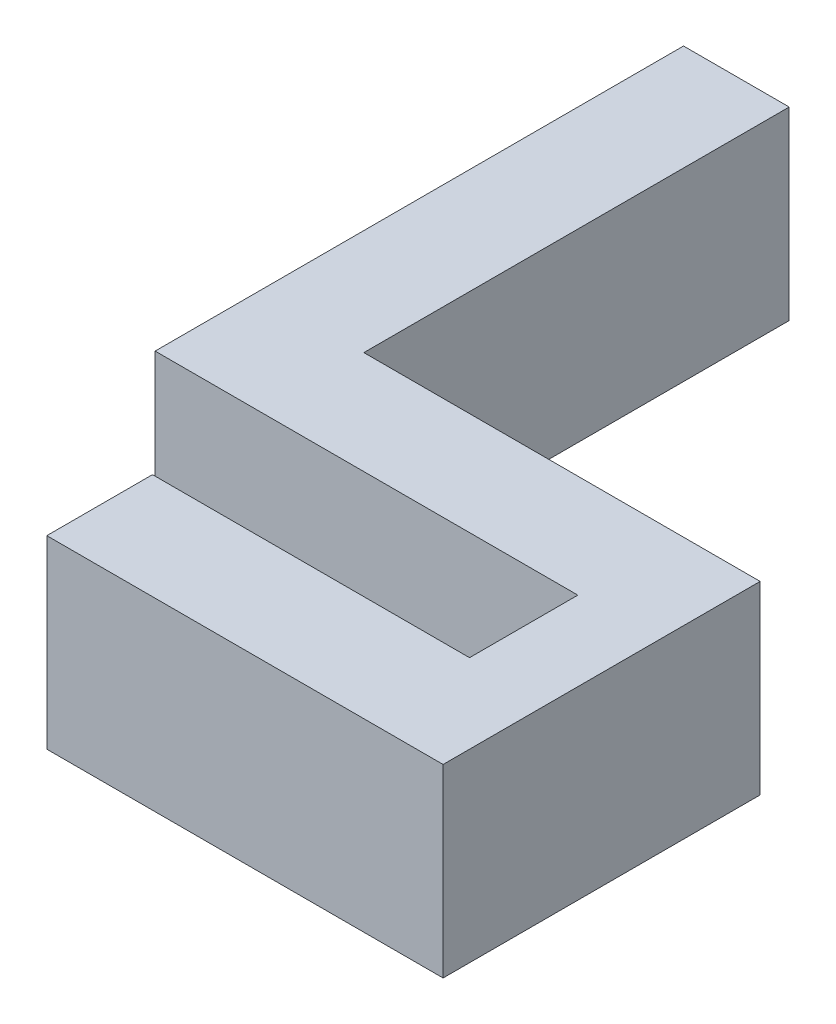
ISO-10303-21;
HEADER;
FILE_DESCRIPTION(('STEP AP214'),'2;1');
FILE_NAME('part.step','',(''),(''),'','','');
FILE_SCHEMA(('AUTOMOTIVE_DESIGN { 1 0 10303 214 1 1 1 1 }'));
ENDSEC;
DATA;
#1=APPLICATION_CONTEXT('core data for automotive mechanical design processes');
#2=APPLICATION_PROTOCOL_DEFINITION('international standard','automotive_design',2000,#1);
#3=PRODUCT_CONTEXT('',#1,'mechanical');
#4=PRODUCT('Part','Part','',(#3));
#5=PRODUCT_RELATED_PRODUCT_CATEGORY('part','',(#4));
#6=PRODUCT_DEFINITION_FORMATION('','',#4);
#7=PRODUCT_DEFINITION_CONTEXT('part definition',#1,'design');
#8=PRODUCT_DEFINITION('design','',#6,#7);
#9=PRODUCT_DEFINITION_SHAPE('','',#8);
#10=(LENGTH_UNIT() NAMED_UNIT(*) SI_UNIT(.MILLI.,.METRE.));
#11=(NAMED_UNIT(*) PLANE_ANGLE_UNIT() SI_UNIT($,.RADIAN.));
#12=(NAMED_UNIT(*) SI_UNIT($,.STERADIAN.) SOLID_ANGLE_UNIT());
#13=UNCERTAINTY_MEASURE_WITH_UNIT(LENGTH_MEASURE(1.E-05),#10,'distance_accuracy_value','');
#14=(GEOMETRIC_REPRESENTATION_CONTEXT(3) GLOBAL_UNCERTAINTY_ASSIGNED_CONTEXT((#13)) GLOBAL_UNIT_ASSIGNED_CONTEXT((#10,
#11,#12)) REPRESENTATION_CONTEXT('',''));
#15=CARTESIAN_POINT('',(0.,0.,0.));
#16=DIRECTION('',(0.,0.,1.));
#17=DIRECTION('',(1.,0.,0.));
#18=AXIS2_PLACEMENT_3D('',#15,#16,#17);
#19=CARTESIAN_POINT('',(0.,0.,0.));
#20=DIRECTION('',(0.,-1.,0.));
#21=DIRECTION('',(0.,0.,-1.));
#22=AXIS2_PLACEMENT_3D('',#19,#20,#21);
#23=PLANE('',#22);
#24=DIRECTION('',(0.,0.,1.));
#25=VECTOR('',#24,1.);
#26=CARTESIAN_POINT('',(12.,0.,0.));
#27=LINE('',#26,#25);
#28=CARTESIAN_POINT('',(12.,0.,-3.9));
#29=VERTEX_POINT('',#28);
#30=CARTESIAN_POINT('',(12.,0.,4.1));
#31=VERTEX_POINT('',#30);
#32=EDGE_CURVE('E160',#29,#31,#27,.T.);
#33=ORIENTED_EDGE('',*,*,#32,.F.);
#34=DIRECTION('',(-1.,0.,0.));
#35=VECTOR('',#34,1.);
#36=CARTESIAN_POINT('',(1.59259259259261,0.,-3.9));
#37=LINE('',#36,#35);
#38=CARTESIAN_POINT('',(15.,0.,-3.9));
#39=VERTEX_POINT('',#38);
#40=EDGE_CURVE('E177',#39,#29,#37,.T.);
#41=ORIENTED_EDGE('',*,*,#40,.F.);
#42=DIRECTION('',(0.,0.,-1.));
#43=VECTOR('',#42,1.);
#44=CARTESIAN_POINT('',(15.,0.,8.1));
#45=LINE('',#44,#43);
#46=CARTESIAN_POINT('',(15.,0.,8.1));
#47=VERTEX_POINT('',#46);
#48=EDGE_CURVE('E173',#47,#39,#45,.T.);
#49=ORIENTED_EDGE('',*,*,#48,.F.);
#50=DIRECTION('',(1.,0.,0.));
#51=VECTOR('',#50,1.);
#52=CARTESIAN_POINT('',(0.,0.,8.1));
#53=LINE('',#52,#51);
#54=CARTESIAN_POINT('',(0.,0.,8.1));
#55=VERTEX_POINT('',#54);
#56=EDGE_CURVE('E170',#55,#47,#53,.T.);
#57=ORIENTED_EDGE('',*,*,#56,.F.);
#58=DIRECTION('',(0.,0.,1.));
#59=VECTOR('',#58,1.);
#60=CARTESIAN_POINT('',(0.,0.,4.1));
#61=LINE('',#60,#59);
#62=CARTESIAN_POINT('',(0.,0.,4.1));
#63=VERTEX_POINT('',#62);
#64=EDGE_CURVE('E167',#63,#55,#61,.T.);
#65=ORIENTED_EDGE('',*,*,#64,.F.);
#66=DIRECTION('',(-1.,0.,0.));
#67=VECTOR('',#66,1.);
#68=CARTESIAN_POINT('',(12.,0.,4.1));
#69=LINE('',#68,#67);
#70=EDGE_CURVE('E164',#31,#63,#69,.T.);
#71=ORIENTED_EDGE('',*,*,#70,.F.);
#72=EDGE_LOOP('',(#33,#41,#49,#57,#65,#71));
#73=FACE_BOUND('',#72,.T.);
#74=ADVANCED_FACE('F45',(#73),#23,.T.);
#75=CARTESIAN_POINT('',(0.,7.,0.));
#76=DIRECTION('',(0.,0.,-1.));
#77=DIRECTION('',(-1.,0.,0.));
#78=AXIS2_PLACEMENT_3D('',#75,#76,#77);
#79=PLANE('',#78);
#80=DIRECTION('',(1.,0.,0.));
#81=VECTOR('',#80,1.);
#82=CARTESIAN_POINT('',(0.,0.,0.));
#83=LINE('',#82,#81);
#84=CARTESIAN_POINT('',(-4.,0.,0.));
#85=VERTEX_POINT('',#84);
#86=CARTESIAN_POINT('',(0.,0.,0.));
#87=VERTEX_POINT('',#86);
#88=EDGE_CURVE('E100',#85,#87,#83,.T.);
#89=ORIENTED_EDGE('',*,*,#88,.T.);
#90=DIRECTION('',(0.,-1.,0.));
#91=VECTOR('',#90,1.);
#92=CARTESIAN_POINT('',(0.,0.,0.));
#93=LINE('',#92,#91);
#94=CARTESIAN_POINT('',(0.,2.6,0.));
#95=VERTEX_POINT('',#94);
#96=EDGE_CURVE('E268',#95,#87,#93,.T.);
#97=ORIENTED_EDGE('',*,*,#96,.F.);
#98=DIRECTION('',(-1.,0.,0.));
#99=VECTOR('',#98,1.);
#100=CARTESIAN_POINT('',(12.,2.6,0.));
#101=LINE('',#100,#99);
#102=CARTESIAN_POINT('',(12.,2.6,0.));
#103=VERTEX_POINT('',#102);
#104=EDGE_CURVE('E274',#103,#95,#101,.T.);
#105=ORIENTED_EDGE('',*,*,#104,.F.);
#106=DIRECTION('',(0.,-1.,0.));
#107=VECTOR('',#106,1.);
#108=CARTESIAN_POINT('',(12.,7.,0.));
#109=LINE('',#108,#107);
#110=CARTESIAN_POINT('',(12.,7.,0.));
#111=VERTEX_POINT('',#110);
#112=EDGE_CURVE('E11',#111,#103,#109,.T.);
#113=ORIENTED_EDGE('',*,*,#112,.F.);
#114=DIRECTION('',(1.,0.,0.));
#115=VECTOR('',#114,1.);
#116=CARTESIAN_POINT('',(0.,7.,0.));
#117=LINE('',#116,#115);
#118=CARTESIAN_POINT('',(-4.,7.,0.));
#119=VERTEX_POINT('',#118);
#120=EDGE_CURVE('E106',#119,#111,#117,.T.);
#121=ORIENTED_EDGE('',*,*,#120,.F.);
#122=DIRECTION('',(0.,-1.,0.));
#123=VECTOR('',#122,1.);
#124=CARTESIAN_POINT('',(-4.,7.,0.));
#125=LINE('',#124,#123);
#126=EDGE_CURVE('E154',#119,#85,#125,.T.);
#127=ORIENTED_EDGE('',*,*,#126,.T.);
#128=EDGE_LOOP('',(#89,#97,#105,#113,#121,#127));
#129=FACE_BOUND('',#128,.T.);
#130=ADVANCED_FACE('F47',(#129),#79,.F.);
#131=CARTESIAN_POINT('',(12.,7.,0.));
#132=DIRECTION('',(1.,0.,0.));
#133=DIRECTION('',(0.,0.,-1.));
#134=AXIS2_PLACEMENT_3D('',#131,#132,#133);
#135=PLANE('',#134);
#136=ORIENTED_EDGE('',*,*,#32,.T.);
#137=DIRECTION('',(0.,-1.,0.));
#138=VECTOR('',#137,1.);
#139=CARTESIAN_POINT('',(12.,7.,4.1));
#140=LINE('',#139,#138);
#141=CARTESIAN_POINT('',(12.,7.,4.1));
#142=VERTEX_POINT('',#141);
#143=EDGE_CURVE('E54',#142,#31,#140,.T.);
#144=ORIENTED_EDGE('',*,*,#143,.F.);
#145=DIRECTION('',(0.,0.,1.));
#146=VECTOR('',#145,1.);
#147=CARTESIAN_POINT('',(12.,7.,0.));
#148=LINE('',#147,#146);
#149=EDGE_CURVE('E251',#111,#142,#148,.T.);
#150=ORIENTED_EDGE('',*,*,#149,.F.);
#151=ORIENTED_EDGE('',*,*,#112,.T.);
#152=DIRECTION('',(0.,0.,1.));
#153=VECTOR('',#152,1.);
#154=CARTESIAN_POINT('',(12.,2.6,-7.));
#155=LINE('',#154,#153);
#156=CARTESIAN_POINT('',(12.,2.6,-3.9));
#157=VERTEX_POINT('',#156);
#158=EDGE_CURVE('E264',#157,#103,#155,.T.);
#159=ORIENTED_EDGE('',*,*,#158,.F.);
#160=DIRECTION('',(0.,1.,0.));
#161=VECTOR('',#160,1.);
#162=CARTESIAN_POINT('',(12.,7.,-3.9));
#163=LINE('',#162,#161);
#164=EDGE_CURVE('E259',#29,#157,#163,.T.);
#165=ORIENTED_EDGE('',*,*,#164,.F.);
#166=EDGE_LOOP('',(#136,#144,#150,#151,#159,#165));
#167=FACE_BOUND('',#166,.T.);
#168=ADVANCED_FACE('F292',(#167),#135,.F.);
#169=CARTESIAN_POINT('',(12.,7.,4.1));
#170=DIRECTION('',(0.,0.,1.));
#171=DIRECTION('',(1.,0.,0.));
#172=AXIS2_PLACEMENT_3D('',#169,#170,#171);
#173=PLANE('',#172);
#174=ORIENTED_EDGE('',*,*,#70,.T.);
#175=DIRECTION('',(0.,-1.,0.));
#176=VECTOR('',#175,1.);
#177=CARTESIAN_POINT('',(0.,7.,4.1));
#178=LINE('',#177,#176);
#179=CARTESIAN_POINT('',(0.,7.,4.1));
#180=VERTEX_POINT('',#179);
#181=EDGE_CURVE('E208',#180,#63,#178,.T.);
#182=ORIENTED_EDGE('',*,*,#181,.F.);
#183=DIRECTION('',(-1.,0.,0.));
#184=VECTOR('',#183,1.);
#185=CARTESIAN_POINT('',(12.,7.,4.1));
#186=LINE('',#185,#184);
#187=EDGE_CURVE('E219',#142,#180,#186,.T.);
#188=ORIENTED_EDGE('',*,*,#187,.F.);
#189=ORIENTED_EDGE('',*,*,#143,.T.);
#190=EDGE_LOOP('',(#174,#182,#188,#189));
#191=FACE_BOUND('',#190,.T.);
#192=ADVANCED_FACE('F217',(#191),#173,.F.);
#193=CARTESIAN_POINT('',(0.,7.,4.1));
#194=DIRECTION('',(1.,0.,0.));
#195=DIRECTION('',(0.,0.,-1.));
#196=AXIS2_PLACEMENT_3D('',#193,#194,#195);
#197=PLANE('',#196);
#198=ORIENTED_EDGE('',*,*,#64,.T.);
#199=DIRECTION('',(0.,-1.,0.));
#200=VECTOR('',#199,1.);
#201=CARTESIAN_POINT('',(0.,7.,8.1));
#202=LINE('',#201,#200);
#203=CARTESIAN_POINT('',(0.,7.,8.1));
#204=VERTEX_POINT('',#203);
#205=EDGE_CURVE('E204',#204,#55,#202,.T.);
#206=ORIENTED_EDGE('',*,*,#205,.F.);
#207=DIRECTION('',(0.,0.,1.));
#208=VECTOR('',#207,1.);
#209=CARTESIAN_POINT('',(0.,7.,4.1));
#210=LINE('',#209,#208);
#211=EDGE_CURVE('E241',#180,#204,#210,.T.);
#212=ORIENTED_EDGE('',*,*,#211,.F.);
#213=ORIENTED_EDGE('',*,*,#181,.T.);
#214=EDGE_LOOP('',(#198,#206,#212,#213));
#215=FACE_BOUND('',#214,.T.);
#216=ADVANCED_FACE('F231',(#215),#197,.F.);
#217=CARTESIAN_POINT('',(0.,7.,8.1));
#218=DIRECTION('',(0.,0.,-1.));
#219=DIRECTION('',(-1.,0.,0.));
#220=AXIS2_PLACEMENT_3D('',#217,#218,#219);
#221=PLANE('',#220);
#222=ORIENTED_EDGE('',*,*,#56,.T.);
#223=DIRECTION('',(0.,-1.,0.));
#224=VECTOR('',#223,1.);
#225=CARTESIAN_POINT('',(15.,7.,8.1));
#226=LINE('',#225,#224);
#227=CARTESIAN_POINT('',(15.,7.,8.1));
#228=VERTEX_POINT('',#227);
#229=EDGE_CURVE('E200',#228,#47,#226,.T.);
#230=ORIENTED_EDGE('',*,*,#229,.F.);
#231=DIRECTION('',(1.,0.,0.));
#232=VECTOR('',#231,1.);
#233=CARTESIAN_POINT('',(0.,7.,8.1));
#234=LINE('',#233,#232);
#235=EDGE_CURVE('E237',#204,#228,#234,.T.);
#236=ORIENTED_EDGE('',*,*,#235,.F.);
#237=ORIENTED_EDGE('',*,*,#205,.T.);
#238=EDGE_LOOP('',(#222,#230,#236,#237));
#239=FACE_BOUND('',#238,.T.);
#240=ADVANCED_FACE('F235',(#239),#221,.F.);
#241=CARTESIAN_POINT('',(15.,7.,8.1));
#242=DIRECTION('',(-1.,0.,0.));
#243=DIRECTION('',(0.,0.,1.));
#244=AXIS2_PLACEMENT_3D('',#241,#242,#243);
#245=PLANE('',#244);
#246=ORIENTED_EDGE('',*,*,#48,.T.);
#247=DIRECTION('',(0.,-1.,0.));
#248=VECTOR('',#247,1.);
#249=CARTESIAN_POINT('',(15.,7.,-3.9));
#250=LINE('',#249,#248);
#251=CARTESIAN_POINT('',(15.,7.,-3.9));
#252=VERTEX_POINT('',#251);
#253=EDGE_CURVE('E196',#252,#39,#250,.T.);
#254=ORIENTED_EDGE('',*,*,#253,.F.);
#255=DIRECTION('',(0.,0.,-1.));
#256=VECTOR('',#255,1.);
#257=CARTESIAN_POINT('',(15.,7.,8.1));
#258=LINE('',#257,#256);
#259=EDGE_CURVE('E240',#228,#252,#258,.T.);
#260=ORIENTED_EDGE('',*,*,#259,.F.);
#261=ORIENTED_EDGE('',*,*,#229,.T.);
#262=EDGE_LOOP('',(#246,#254,#260,#261));
#263=FACE_BOUND('',#262,.T.);
#264=ADVANCED_FACE('F324',(#263),#245,.F.);
#265=CARTESIAN_POINT('',(1.59259259259261,7.,-3.9));
#266=DIRECTION('',(0.,0.,1.));
#267=DIRECTION('',(1.,0.,0.));
#268=AXIS2_PLACEMENT_3D('',#265,#266,#267);
#269=PLANE('',#268);
#270=ORIENTED_EDGE('',*,*,#40,.T.);
#271=ORIENTED_EDGE('',*,*,#164,.T.);
#272=DIRECTION('',(-1.,0.,0.));
#273=VECTOR('',#272,1.);
#274=CARTESIAN_POINT('',(1.59259259259261,2.6,-3.9));
#275=LINE('',#274,#273);
#276=CARTESIAN_POINT('',(0.,2.6,-3.9));
#277=VERTEX_POINT('',#276);
#278=EDGE_CURVE('E161',#157,#277,#275,.T.);
#279=ORIENTED_EDGE('',*,*,#278,.T.);
#280=DIRECTION('',(0.,-1.,0.));
#281=VECTOR('',#280,1.);
#282=CARTESIAN_POINT('',(0.,7.,-3.9));
#283=LINE('',#282,#281);
#284=CARTESIAN_POINT('',(0.,7.,-3.9));
#285=VERTEX_POINT('',#284);
#286=EDGE_CURVE('E146',#285,#277,#283,.T.);
#287=ORIENTED_EDGE('',*,*,#286,.F.);
#288=DIRECTION('',(-1.,0.,0.));
#289=VECTOR('',#288,1.);
#290=CARTESIAN_POINT('',(15.,7.,-3.9));
#291=LINE('',#290,#289);
#292=EDGE_CURVE('E135',#252,#285,#291,.T.);
#293=ORIENTED_EDGE('',*,*,#292,.F.);
#294=ORIENTED_EDGE('',*,*,#253,.T.);
#295=EDGE_LOOP('',(#270,#271,#279,#287,#293,#294));
#296=FACE_BOUND('',#295,.T.);
#297=ADVANCED_FACE('F291',(#296),#269,.F.);
#298=CARTESIAN_POINT('',(0.,7.,-3.9));
#299=DIRECTION('',(-1.,0.,0.));
#300=DIRECTION('',(0.,0.,1.));
#301=AXIS2_PLACEMENT_3D('',#298,#299,#300);
#302=PLANE('',#301);
#303=ORIENTED_EDGE('',*,*,#286,.T.);
#304=DIRECTION('',(0.,0.,1.));
#305=VECTOR('',#304,1.);
#306=CARTESIAN_POINT('',(0.,2.6,-7.));
#307=LINE('',#306,#305);
#308=EDGE_CURVE('E263',#277,#95,#307,.T.);
#309=ORIENTED_EDGE('',*,*,#308,.T.);
#310=ORIENTED_EDGE('',*,*,#96,.T.);
#311=DIRECTION('',(0.,0.,-1.));
#312=VECTOR('',#311,1.);
#313=CARTESIAN_POINT('',(0.,0.,-3.9));
#314=LINE('',#313,#312);
#315=CARTESIAN_POINT('',(0.,0.,-20.));
#316=VERTEX_POINT('',#315);
#317=EDGE_CURVE('E61',#87,#316,#314,.T.);
#318=ORIENTED_EDGE('',*,*,#317,.T.);
#319=DIRECTION('',(0.,-1.,0.));
#320=VECTOR('',#319,1.);
#321=CARTESIAN_POINT('',(0.,7.,-20.));
#322=LINE('',#321,#320);
#323=CARTESIAN_POINT('',(0.,7.,-20.));
#324=VERTEX_POINT('',#323);
#325=EDGE_CURVE('E142',#324,#316,#322,.T.);
#326=ORIENTED_EDGE('',*,*,#325,.F.);
#327=DIRECTION('',(0.,0.,-1.));
#328=VECTOR('',#327,1.);
#329=CARTESIAN_POINT('',(0.,7.,-3.9));
#330=LINE('',#329,#328);
#331=EDGE_CURVE('E128',#285,#324,#330,.T.);
#332=ORIENTED_EDGE('',*,*,#331,.F.);
#333=EDGE_LOOP('',(#303,#309,#310,#318,#326,#332));
#334=FACE_BOUND('',#333,.T.);
#335=ADVANCED_FACE('F143',(#334),#302,.F.);
#336=CARTESIAN_POINT('',(-4.,7.,-20.));
#337=DIRECTION('',(0.,0.,1.));
#338=DIRECTION('',(1.,0.,0.));
#339=AXIS2_PLACEMENT_3D('',#336,#337,#338);
#340=PLANE('',#339);
#341=DIRECTION('',(-1.,0.,0.));
#342=VECTOR('',#341,1.);
#343=CARTESIAN_POINT('',(-4.,0.,-20.));
#344=LINE('',#343,#342);
#345=CARTESIAN_POINT('',(-4.,0.,-20.));
#346=VERTEX_POINT('',#345);
#347=EDGE_CURVE('E183',#316,#346,#344,.T.);
#348=ORIENTED_EDGE('',*,*,#347,.T.);
#349=DIRECTION('',(0.,-1.,0.));
#350=VECTOR('',#349,1.);
#351=CARTESIAN_POINT('',(-4.,7.,-20.));
#352=LINE('',#351,#350);
#353=CARTESIAN_POINT('',(-4.,7.,-20.));
#354=VERTEX_POINT('',#353);
#355=EDGE_CURVE('E147',#354,#346,#352,.T.);
#356=ORIENTED_EDGE('',*,*,#355,.F.);
#357=DIRECTION('',(-1.,0.,0.));
#358=VECTOR('',#357,1.);
#359=CARTESIAN_POINT('',(-4.,7.,-20.));
#360=LINE('',#359,#358);
#361=EDGE_CURVE('E132',#324,#354,#360,.T.);
#362=ORIENTED_EDGE('',*,*,#361,.F.);
#363=ORIENTED_EDGE('',*,*,#325,.T.);
#364=EDGE_LOOP('',(#348,#356,#362,#363));
#365=FACE_BOUND('',#364,.T.);
#366=ADVANCED_FACE('F149',(#365),#340,.F.);
#367=CARTESIAN_POINT('',(-4.,7.,0.));
#368=DIRECTION('',(1.,0.,0.));
#369=DIRECTION('',(0.,0.,-1.));
#370=AXIS2_PLACEMENT_3D('',#367,#368,#369);
#371=PLANE('',#370);
#372=DIRECTION('',(0.,0.,1.));
#373=VECTOR('',#372,1.);
#374=CARTESIAN_POINT('',(-4.,0.,0.));
#375=LINE('',#374,#373);
#376=EDGE_CURVE('E186',#346,#85,#375,.T.);
#377=ORIENTED_EDGE('',*,*,#376,.T.);
#378=ORIENTED_EDGE('',*,*,#126,.F.);
#379=DIRECTION('',(0.,0.,1.));
#380=VECTOR('',#379,1.);
#381=CARTESIAN_POINT('',(-4.,7.,0.));
#382=LINE('',#381,#380);
#383=EDGE_CURVE('E70',#354,#119,#382,.T.);
#384=ORIENTED_EDGE('',*,*,#383,.F.);
#385=ORIENTED_EDGE('',*,*,#355,.T.);
#386=EDGE_LOOP('',(#377,#378,#384,#385));
#387=FACE_BOUND('',#386,.T.);
#388=ADVANCED_FACE('F295',(#387),#371,.F.);
#389=CARTESIAN_POINT('',(0.,7.,0.));
#390=DIRECTION('',(0.,-1.,0.));
#391=DIRECTION('',(0.,0.,-1.));
#392=AXIS2_PLACEMENT_3D('',#389,#390,#391);
#393=PLANE('',#392);
#394=ORIENTED_EDGE('',*,*,#120,.T.);
#395=ORIENTED_EDGE('',*,*,#149,.T.);
#396=ORIENTED_EDGE('',*,*,#187,.T.);
#397=ORIENTED_EDGE('',*,*,#211,.T.);
#398=ORIENTED_EDGE('',*,*,#235,.T.);
#399=ORIENTED_EDGE('',*,*,#259,.T.);
#400=ORIENTED_EDGE('',*,*,#292,.T.);
#401=ORIENTED_EDGE('',*,*,#331,.T.);
#402=ORIENTED_EDGE('',*,*,#361,.T.);
#403=ORIENTED_EDGE('',*,*,#383,.T.);
#404=EDGE_LOOP('',(#394,#395,#396,#397,#398,#399,#400,#401,#402,#403));
#405=FACE_BOUND('',#404,.T.);
#406=ADVANCED_FACE('F130',(#405),#393,.F.);
#407=ORIENTED_EDGE('',*,*,#317,.F.);
#408=ORIENTED_EDGE('',*,*,#88,.F.);
#409=ORIENTED_EDGE('',*,*,#376,.F.);
#410=ORIENTED_EDGE('',*,*,#347,.F.);
#411=EDGE_LOOP('',(#407,#408,#409,#410));
#412=FACE_BOUND('',#411,.T.);
#413=ADVANCED_FACE('F296',(#412),#23,.T.);
#414=CARTESIAN_POINT('',(12.,2.6,-7.));
#415=DIRECTION('',(0.,1.,0.));
#416=DIRECTION('',(-1.,0.,0.));
#417=AXIS2_PLACEMENT_3D('',#414,#415,#416);
#418=PLANE('',#417);
#419=ORIENTED_EDGE('',*,*,#158,.T.);
#420=ORIENTED_EDGE('',*,*,#104,.T.);
#421=ORIENTED_EDGE('',*,*,#308,.F.);
#422=ORIENTED_EDGE('',*,*,#278,.F.);
#423=EDGE_LOOP('',(#419,#420,#421,#422));
#424=FACE_BOUND('',#423,.T.);
#425=ADVANCED_FACE('F282',(#424),#418,.F.);
#426=CLOSED_SHELL('',(#74,#130,#168,#192,#216,#240,#264,#297,#335,#366,#388,#406,#413,#425));
#427=MANIFOLD_SOLID_BREP('B2',#426);
#428=ADVANCED_BREP_SHAPE_REPRESENTATION('',(#18,#427),#14);
#429=SHAPE_DEFINITION_REPRESENTATION(#9,#428);
ENDSEC;
END-ISO-10303-21;
